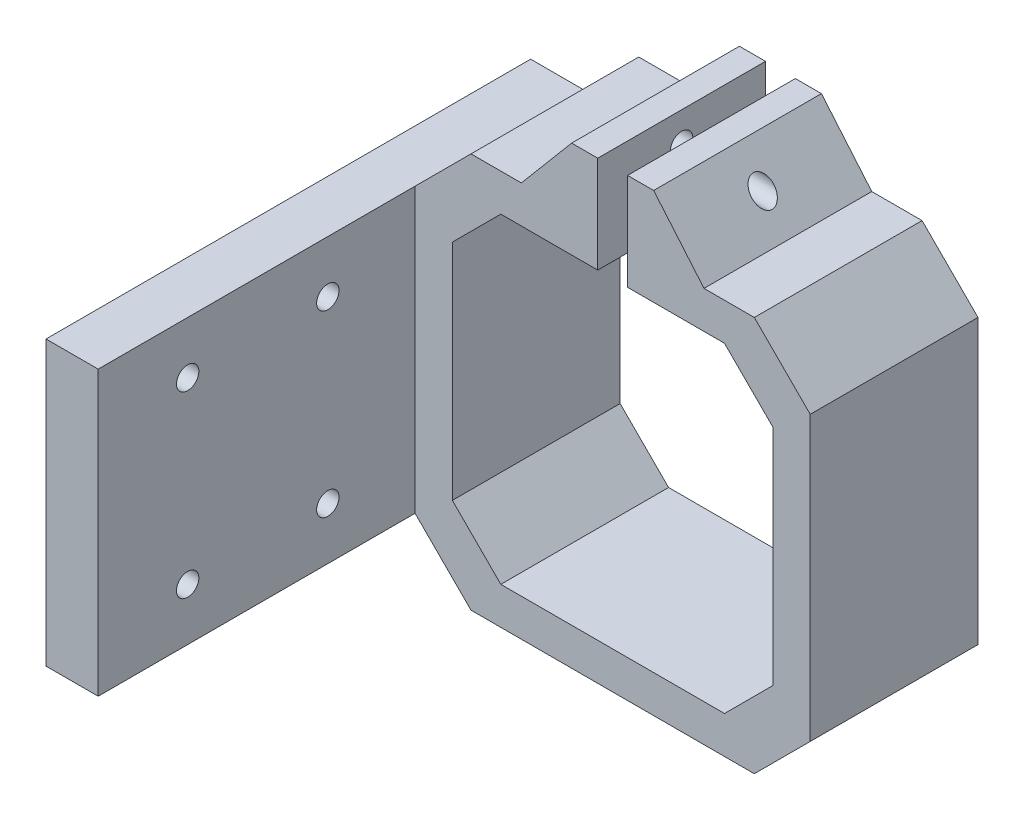
ISO-10303-21;
HEADER;
FILE_DESCRIPTION(('STEP AP214'),'2;1');
FILE_NAME('part.step','',(''),(''),'','','');
FILE_SCHEMA(('AUTOMOTIVE_DESIGN { 1 0 10303 214 1 1 1 1 }'));
ENDSEC;
DATA;
#1=APPLICATION_CONTEXT('core data for automotive mechanical design processes');
#2=APPLICATION_PROTOCOL_DEFINITION('international standard','automotive_design',2000,#1);
#3=PRODUCT_CONTEXT('',#1,'mechanical');
#4=PRODUCT('Part','Part','',(#3));
#5=PRODUCT_RELATED_PRODUCT_CATEGORY('part','',(#4));
#6=PRODUCT_DEFINITION_FORMATION('','',#4);
#7=PRODUCT_DEFINITION_CONTEXT('part definition',#1,'design');
#8=PRODUCT_DEFINITION('design','',#6,#7);
#9=PRODUCT_DEFINITION_SHAPE('','',#8);
#10=(LENGTH_UNIT() NAMED_UNIT(*) SI_UNIT(.MILLI.,.METRE.));
#11=(NAMED_UNIT(*) PLANE_ANGLE_UNIT() SI_UNIT($,.RADIAN.));
#12=(NAMED_UNIT(*) SI_UNIT($,.STERADIAN.) SOLID_ANGLE_UNIT());
#13=UNCERTAINTY_MEASURE_WITH_UNIT(LENGTH_MEASURE(1.E-05),#10,'distance_accuracy_value','');
#14=(GEOMETRIC_REPRESENTATION_CONTEXT(3) GLOBAL_UNCERTAINTY_ASSIGNED_CONTEXT((#13)) GLOBAL_UNIT_ASSIGNED_CONTEXT((#10,
#11,#12)) REPRESENTATION_CONTEXT('',''));
#15=CARTESIAN_POINT('',(0.,0.,0.));
#16=DIRECTION('',(0.,0.,1.));
#17=DIRECTION('',(1.,0.,0.));
#18=AXIS2_PLACEMENT_3D('',#15,#16,#17);
#19=CARTESIAN_POINT('',(-2.,21.5,22.5));
#20=DIRECTION('',(0.,1.,0.));
#21=DIRECTION('',(0.,0.,1.));
#22=AXIS2_PLACEMENT_3D('',#19,#20,#21);
#23=PLANE('',#22);
#24=DIRECTION('',(1.,0.,0.));
#25=VECTOR('',#24,1.);
#26=CARTESIAN_POINT('',(-2.,21.5,0.));
#27=LINE('',#26,#25);
#28=CARTESIAN_POINT('',(-15.,21.5,0.));
#29=VERTEX_POINT('',#28);
#30=CARTESIAN_POINT('',(-2.,21.5,0.));
#31=VERTEX_POINT('',#30);
#32=EDGE_CURVE('E221',#29,#31,#27,.T.);
#33=ORIENTED_EDGE('',*,*,#32,.T.);
#34=DIRECTION('',(0.,0.,-1.));
#35=VECTOR('',#34,1.);
#36=CARTESIAN_POINT('',(-2.,21.5,22.5));
#37=LINE('',#36,#35);
#38=CARTESIAN_POINT('',(-2.,21.5,22.5));
#39=VERTEX_POINT('',#38);
#40=EDGE_CURVE('E11',#39,#31,#37,.T.);
#41=ORIENTED_EDGE('',*,*,#40,.F.);
#42=DIRECTION('',(1.,0.,0.));
#43=VECTOR('',#42,1.);
#44=CARTESIAN_POINT('',(-2.,21.5,22.5));
#45=LINE('',#44,#43);
#46=CARTESIAN_POINT('',(-15.,21.5,22.5));
#47=VERTEX_POINT('',#46);
#48=EDGE_CURVE('E267',#47,#39,#45,.T.);
#49=ORIENTED_EDGE('',*,*,#48,.F.);
#50=DIRECTION('',(0.,0.,-1.));
#51=VECTOR('',#50,1.);
#52=CARTESIAN_POINT('',(-15.,21.5,22.5));
#53=LINE('',#52,#51);
#54=EDGE_CURVE('E217',#47,#29,#53,.T.);
#55=ORIENTED_EDGE('',*,*,#54,.T.);
#56=EDGE_LOOP('',(#33,#41,#49,#55));
#57=FACE_BOUND('',#56,.T.);
#58=ADVANCED_FACE('F33',(#57),#23,.F.);
#59=CARTESIAN_POINT('',(-2.,34.5,22.5));
#60=DIRECTION('',(-1.,0.,0.));
#61=DIRECTION('',(0.,-1.,0.));
#62=AXIS2_PLACEMENT_3D('',#59,#60,#61);
#63=PLANE('',#62);
#64=CARTESIAN_POINT('',(-2.,30.5,11.25));
#65=DIRECTION('',(-1.,0.,0.));
#66=DIRECTION('',(0.,-1.,0.));
#67=AXIS2_PLACEMENT_3D('',#64,#65,#66);
#68=CIRCLE('',#67,1.5);
#69=CARTESIAN_POINT('',(-2.,29.,11.25));
#70=VERTEX_POINT('',#69);
#71=EDGE_CURVE('E731',#70,#70,#68,.T.);
#72=ORIENTED_EDGE('',*,*,#71,.T.);
#73=EDGE_LOOP('',(#72));
#74=FACE_BOUND('',#73,.T.);
#75=DIRECTION('',(0.,1.,0.));
#76=VECTOR('',#75,1.);
#77=CARTESIAN_POINT('',(-2.,34.5,0.));
#78=LINE('',#77,#76);
#79=CARTESIAN_POINT('',(-2.,34.5,0.));
#80=VERTEX_POINT('',#79);
#81=EDGE_CURVE('E224',#31,#80,#78,.T.);
#82=ORIENTED_EDGE('',*,*,#81,.T.);
#83=DIRECTION('',(0.,0.,-1.));
#84=VECTOR('',#83,1.);
#85=CARTESIAN_POINT('',(-2.,34.5,22.5));
#86=LINE('',#85,#84);
#87=CARTESIAN_POINT('',(-2.,34.5,22.5));
#88=VERTEX_POINT('',#87);
#89=EDGE_CURVE('E42',#88,#80,#86,.T.);
#90=ORIENTED_EDGE('',*,*,#89,.F.);
#91=DIRECTION('',(0.,1.,0.));
#92=VECTOR('',#91,1.);
#93=CARTESIAN_POINT('',(-2.,34.5,22.5));
#94=LINE('',#93,#92);
#95=EDGE_CURVE('E137',#39,#88,#94,.T.);
#96=ORIENTED_EDGE('',*,*,#95,.F.);
#97=ORIENTED_EDGE('',*,*,#40,.T.);
#98=EDGE_LOOP('',(#82,#90,#96,#97));
#99=FACE_BOUND('',#98,.T.);
#100=ADVANCED_FACE('F387',(#74,#99),#63,.F.);
#101=CARTESIAN_POINT('',(-5.5,34.5,22.5));
#102=DIRECTION('',(0.,-1.,0.));
#103=DIRECTION('',(0.,0.,-1.));
#104=AXIS2_PLACEMENT_3D('',#101,#102,#103);
#105=PLANE('',#104);
#106=DIRECTION('',(-1.,0.,0.));
#107=VECTOR('',#106,1.);
#108=CARTESIAN_POINT('',(-5.5,34.5,0.));
#109=LINE('',#108,#107);
#110=CARTESIAN_POINT('',(-5.5,34.5,0.));
#111=VERTEX_POINT('',#110);
#112=EDGE_CURVE('E227',#80,#111,#109,.T.);
#113=ORIENTED_EDGE('',*,*,#112,.T.);
#114=DIRECTION('',(0.,0.,-1.));
#115=VECTOR('',#114,1.);
#116=CARTESIAN_POINT('',(-5.5,34.5,22.5));
#117=LINE('',#116,#115);
#118=CARTESIAN_POINT('',(-5.5,34.5,22.5));
#119=VERTEX_POINT('',#118);
#120=EDGE_CURVE('E318',#119,#111,#117,.T.);
#121=ORIENTED_EDGE('',*,*,#120,.F.);
#122=DIRECTION('',(-1.,0.,0.));
#123=VECTOR('',#122,1.);
#124=CARTESIAN_POINT('',(-5.5,34.5,22.5));
#125=LINE('',#124,#123);
#126=EDGE_CURVE('E741',#88,#119,#125,.T.);
#127=ORIENTED_EDGE('',*,*,#126,.F.);
#128=ORIENTED_EDGE('',*,*,#89,.T.);
#129=EDGE_LOOP('',(#113,#121,#127,#128));
#130=FACE_BOUND('',#129,.T.);
#131=ADVANCED_FACE('F392',(#130),#105,.F.);
#132=CARTESIAN_POINT('',(-12.25,26.5,22.5));
#133=DIRECTION('',(0.764291483507891,-0.644870939209783,0.));
#134=DIRECTION('',(0.644870939209783,0.764291483507891,0.));
#135=AXIS2_PLACEMENT_3D('',#132,#133,#134);
#136=PLANE('',#135);
#137=CARTESIAN_POINT('',(-8.875,30.5,11.25));
#138=DIRECTION('',(0.764291483507891,-0.644870939209783,0.));
#139=DIRECTION('',(0.644870939209783,0.764291483507891,0.));
#140=AXIS2_PLACEMENT_3D('',#137,#138,#139);
#141=ELLIPSE('',#140,1.96260200769922,1.5);
#142=CARTESIAN_POINT('',(-7.609375,32.,11.25));
#143=VERTEX_POINT('',#142);
#144=EDGE_CURVE('E752',#143,#143,#141,.T.);
#145=ORIENTED_EDGE('',*,*,#144,.T.);
#146=EDGE_LOOP('',(#145));
#147=FACE_BOUND('',#146,.T.);
#148=DIRECTION('',(-0.644870939209783,-0.764291483507891,0.));
#149=VECTOR('',#148,1.);
#150=CARTESIAN_POINT('',(-12.25,26.5,0.));
#151=LINE('',#150,#149);
#152=CARTESIAN_POINT('',(-12.25,26.5,0.));
#153=VERTEX_POINT('',#152);
#154=EDGE_CURVE('E229',#111,#153,#151,.T.);
#155=ORIENTED_EDGE('',*,*,#154,.T.);
#156=DIRECTION('',(0.,0.,-1.));
#157=VECTOR('',#156,1.);
#158=CARTESIAN_POINT('',(-12.25,26.5,22.5));
#159=LINE('',#158,#157);
#160=CARTESIAN_POINT('',(-12.25,26.5,22.5));
#161=VERTEX_POINT('',#160);
#162=EDGE_CURVE('E314',#161,#153,#159,.T.);
#163=ORIENTED_EDGE('',*,*,#162,.F.);
#164=DIRECTION('',(-0.644870939209783,-0.764291483507891,0.));
#165=VECTOR('',#164,1.);
#166=CARTESIAN_POINT('',(-12.25,26.5,22.5));
#167=LINE('',#166,#165);
#168=EDGE_CURVE('E742',#119,#161,#167,.T.);
#169=ORIENTED_EDGE('',*,*,#168,.F.);
#170=ORIENTED_EDGE('',*,*,#120,.T.);
#171=EDGE_LOOP('',(#155,#163,#169,#170));
#172=FACE_BOUND('',#171,.T.);
#173=ADVANCED_FACE('F398',(#147,#172),#136,.F.);
#174=CARTESIAN_POINT('',(-19.,26.5,22.5));
#175=DIRECTION('',(0.,-1.,0.));
#176=DIRECTION('',(0.,0.,-1.));
#177=AXIS2_PLACEMENT_3D('',#174,#175,#176);
#178=PLANE('',#177);
#179=DIRECTION('',(-1.,0.,0.));
#180=VECTOR('',#179,1.);
#181=CARTESIAN_POINT('',(-19.,26.5,0.));
#182=LINE('',#181,#180);
#183=CARTESIAN_POINT('',(-19.,26.5,0.));
#184=VERTEX_POINT('',#183);
#185=EDGE_CURVE('E231',#153,#184,#182,.T.);
#186=ORIENTED_EDGE('',*,*,#185,.T.);
#187=DIRECTION('',(0.,0.,-1.));
#188=VECTOR('',#187,1.);
#189=CARTESIAN_POINT('',(-19.,26.5,22.5));
#190=LINE('',#189,#188);
#191=CARTESIAN_POINT('',(-19.,26.5,22.5));
#192=VERTEX_POINT('',#191);
#193=EDGE_CURVE('E311',#192,#184,#190,.T.);
#194=ORIENTED_EDGE('',*,*,#193,.F.);
#195=DIRECTION('',(-1.,0.,0.));
#196=VECTOR('',#195,1.);
#197=CARTESIAN_POINT('',(-19.,26.5,22.5));
#198=LINE('',#197,#196);
#199=EDGE_CURVE('E333',#161,#192,#198,.T.);
#200=ORIENTED_EDGE('',*,*,#199,.F.);
#201=ORIENTED_EDGE('',*,*,#162,.T.);
#202=EDGE_LOOP('',(#186,#194,#200,#201));
#203=FACE_BOUND('',#202,.T.);
#204=ADVANCED_FACE('F404',(#203),#178,.F.);
#205=CARTESIAN_POINT('',(-26.5,19.,22.5));
#206=DIRECTION('',(0.707106781186548,-0.707106781186547,0.));
#207=DIRECTION('',(0.707106781186547,0.707106781186548,0.));
#208=AXIS2_PLACEMENT_3D('',#205,#206,#207);
#209=PLANE('',#208);
#210=DIRECTION('',(-0.707106781186547,-0.707106781186548,0.));
#211=VECTOR('',#210,1.);
#212=CARTESIAN_POINT('',(-26.5,19.,0.));
#213=LINE('',#212,#211);
#214=CARTESIAN_POINT('',(-26.5,19.,0.));
#215=VERTEX_POINT('',#214);
#216=EDGE_CURVE('E233',#184,#215,#213,.T.);
#217=ORIENTED_EDGE('',*,*,#216,.T.);
#218=DIRECTION('',(0.,0.,-1.));
#219=VECTOR('',#218,1.);
#220=CARTESIAN_POINT('',(-26.5,19.,22.5));
#221=LINE('',#220,#219);
#222=CARTESIAN_POINT('',(-26.5,19.,22.5));
#223=VERTEX_POINT('',#222);
#224=EDGE_CURVE('E315',#223,#215,#221,.T.);
#225=ORIENTED_EDGE('',*,*,#224,.F.);
#226=DIRECTION('',(-0.707106781186547,-0.707106781186548,0.));
#227=VECTOR('',#226,1.);
#228=CARTESIAN_POINT('',(-26.5,19.,22.5));
#229=LINE('',#228,#227);
#230=EDGE_CURVE('E328',#192,#223,#229,.T.);
#231=ORIENTED_EDGE('',*,*,#230,.F.);
#232=ORIENTED_EDGE('',*,*,#193,.T.);
#233=EDGE_LOOP('',(#217,#225,#231,#232));
#234=FACE_BOUND('',#233,.T.);
#235=ADVANCED_FACE('F408',(#234),#209,.F.);
#236=CARTESIAN_POINT('',(-19.,-26.5,22.5));
#237=DIRECTION('',(0.707106781186548,0.707106781186547,0.));
#238=DIRECTION('',(-0.707106781186547,0.707106781186548,0.));
#239=AXIS2_PLACEMENT_3D('',#236,#237,#238);
#240=PLANE('',#239);
#241=DIRECTION('',(0.707106781186547,-0.707106781186548,0.));
#242=VECTOR('',#241,1.);
#243=CARTESIAN_POINT('',(-19.,-26.5,0.));
#244=LINE('',#243,#242);
#245=CARTESIAN_POINT('',(-26.5,-19.,0.));
#246=VERTEX_POINT('',#245);
#247=CARTESIAN_POINT('',(-19.,-26.5,0.));
#248=VERTEX_POINT('',#247);
#249=EDGE_CURVE('E236',#246,#248,#244,.T.);
#250=ORIENTED_EDGE('',*,*,#249,.T.);
#251=DIRECTION('',(0.,0.,-1.));
#252=VECTOR('',#251,1.);
#253=CARTESIAN_POINT('',(-19.,-26.5,22.5));
#254=LINE('',#253,#252);
#255=CARTESIAN_POINT('',(-19.,-26.5,22.5));
#256=VERTEX_POINT('',#255);
#257=EDGE_CURVE('E307',#256,#248,#254,.T.);
#258=ORIENTED_EDGE('',*,*,#257,.F.);
#259=DIRECTION('',(0.707106781186547,-0.707106781186548,0.));
#260=VECTOR('',#259,1.);
#261=CARTESIAN_POINT('',(-19.,-26.5,22.5));
#262=LINE('',#261,#260);
#263=CARTESIAN_POINT('',(-26.5,-19.,22.5));
#264=VERTEX_POINT('',#263);
#265=EDGE_CURVE('E327',#264,#256,#262,.T.);
#266=ORIENTED_EDGE('',*,*,#265,.F.);
#267=DIRECTION('',(0.,0.,-1.));
#268=VECTOR('',#267,1.);
#269=CARTESIAN_POINT('',(-26.5,-19.,22.5));
#270=LINE('',#269,#268);
#271=EDGE_CURVE('E310',#264,#246,#270,.T.);
#272=ORIENTED_EDGE('',*,*,#271,.T.);
#273=EDGE_LOOP('',(#250,#258,#266,#272));
#274=FACE_BOUND('',#273,.T.);
#275=ADVANCED_FACE('F412',(#274),#240,.F.);
#276=CARTESIAN_POINT('',(19.,-26.5,22.5));
#277=DIRECTION('',(0.,1.,0.));
#278=DIRECTION('',(0.,0.,1.));
#279=AXIS2_PLACEMENT_3D('',#276,#277,#278);
#280=PLANE('',#279);
#281=DIRECTION('',(1.,0.,0.));
#282=VECTOR('',#281,1.);
#283=CARTESIAN_POINT('',(19.,-26.5,0.));
#284=LINE('',#283,#282);
#285=CARTESIAN_POINT('',(19.,-26.5,0.));
#286=VERTEX_POINT('',#285);
#287=EDGE_CURVE('E238',#248,#286,#284,.T.);
#288=ORIENTED_EDGE('',*,*,#287,.T.);
#289=DIRECTION('',(0.,0.,-1.));
#290=VECTOR('',#289,1.);
#291=CARTESIAN_POINT('',(19.,-26.5,22.5));
#292=LINE('',#291,#290);
#293=CARTESIAN_POINT('',(19.,-26.5,22.5));
#294=VERTEX_POINT('',#293);
#295=EDGE_CURVE('E304',#294,#286,#292,.T.);
#296=ORIENTED_EDGE('',*,*,#295,.F.);
#297=DIRECTION('',(1.,0.,0.));
#298=VECTOR('',#297,1.);
#299=CARTESIAN_POINT('',(19.,-26.5,22.5));
#300=LINE('',#299,#298);
#301=EDGE_CURVE('E335',#256,#294,#300,.T.);
#302=ORIENTED_EDGE('',*,*,#301,.F.);
#303=ORIENTED_EDGE('',*,*,#257,.T.);
#304=EDGE_LOOP('',(#288,#296,#302,#303));
#305=FACE_BOUND('',#304,.T.);
#306=ADVANCED_FACE('F416',(#305),#280,.F.);
#307=CARTESIAN_POINT('',(26.5,-19.,22.5));
#308=DIRECTION('',(-0.707106781186545,0.70710678118655,0.));
#309=DIRECTION('',(-0.70710678118655,-0.707106781186545,0.));
#310=AXIS2_PLACEMENT_3D('',#307,#308,#309);
#311=PLANE('',#310);
#312=DIRECTION('',(0.70710678118655,0.707106781186545,0.));
#313=VECTOR('',#312,1.);
#314=CARTESIAN_POINT('',(26.5,-19.,0.));
#315=LINE('',#314,#313);
#316=CARTESIAN_POINT('',(26.5,-19.,0.));
#317=VERTEX_POINT('',#316);
#318=EDGE_CURVE('E240',#286,#317,#315,.T.);
#319=ORIENTED_EDGE('',*,*,#318,.T.);
#320=DIRECTION('',(0.,0.,-1.));
#321=VECTOR('',#320,1.);
#322=CARTESIAN_POINT('',(26.5,-19.,22.5));
#323=LINE('',#322,#321);
#324=CARTESIAN_POINT('',(26.5,-19.,22.5));
#325=VERTEX_POINT('',#324);
#326=EDGE_CURVE('E301',#325,#317,#323,.T.);
#327=ORIENTED_EDGE('',*,*,#326,.F.);
#328=DIRECTION('',(0.70710678118655,0.707106781186545,0.));
#329=VECTOR('',#328,1.);
#330=CARTESIAN_POINT('',(26.5,-19.,22.5));
#331=LINE('',#330,#329);
#332=EDGE_CURVE('E337',#294,#325,#331,.T.);
#333=ORIENTED_EDGE('',*,*,#332,.F.);
#334=ORIENTED_EDGE('',*,*,#295,.T.);
#335=EDGE_LOOP('',(#319,#327,#333,#334));
#336=FACE_BOUND('',#335,.T.);
#337=ADVANCED_FACE('F420',(#336),#311,.F.);
#338=CARTESIAN_POINT('',(26.5,19.,22.5));
#339=DIRECTION('',(-1.,0.,0.));
#340=DIRECTION('',(0.,-1.,0.));
#341=AXIS2_PLACEMENT_3D('',#338,#339,#340);
#342=PLANE('',#341);
#343=DIRECTION('',(0.,1.,0.));
#344=VECTOR('',#343,1.);
#345=CARTESIAN_POINT('',(26.5,19.,0.));
#346=LINE('',#345,#344);
#347=CARTESIAN_POINT('',(26.5,19.,0.));
#348=VERTEX_POINT('',#347);
#349=EDGE_CURVE('E242',#317,#348,#346,.T.);
#350=ORIENTED_EDGE('',*,*,#349,.T.);
#351=DIRECTION('',(0.,0.,-1.));
#352=VECTOR('',#351,1.);
#353=CARTESIAN_POINT('',(26.5,19.,22.5));
#354=LINE('',#353,#352);
#355=CARTESIAN_POINT('',(26.5,19.,22.5));
#356=VERTEX_POINT('',#355);
#357=EDGE_CURVE('E298',#356,#348,#354,.T.);
#358=ORIENTED_EDGE('',*,*,#357,.F.);
#359=DIRECTION('',(0.,1.,0.));
#360=VECTOR('',#359,1.);
#361=CARTESIAN_POINT('',(26.5,19.,22.5));
#362=LINE('',#361,#360);
#363=EDGE_CURVE('E339',#325,#356,#362,.T.);
#364=ORIENTED_EDGE('',*,*,#363,.F.);
#365=ORIENTED_EDGE('',*,*,#326,.T.);
#366=EDGE_LOOP('',(#350,#358,#364,#365));
#367=FACE_BOUND('',#366,.T.);
#368=ADVANCED_FACE('F424',(#367),#342,.F.);
#369=CARTESIAN_POINT('',(19.,26.5,22.5));
#370=DIRECTION('',(-0.707106781186551,-0.707106781186543,0.));
#371=DIRECTION('',(0.707106781186544,-0.707106781186552,0.));
#372=AXIS2_PLACEMENT_3D('',#369,#370,#371);
#373=PLANE('',#372);
#374=DIRECTION('',(-0.707106781186544,0.707106781186551,0.));
#375=VECTOR('',#374,1.);
#376=CARTESIAN_POINT('',(19.,26.5,0.));
#377=LINE('',#376,#375);
#378=CARTESIAN_POINT('',(19.,26.5,0.));
#379=VERTEX_POINT('',#378);
#380=EDGE_CURVE('E244',#348,#379,#377,.T.);
#381=ORIENTED_EDGE('',*,*,#380,.T.);
#382=DIRECTION('',(0.,0.,-1.));
#383=VECTOR('',#382,1.);
#384=CARTESIAN_POINT('',(19.,26.5,22.5));
#385=LINE('',#384,#383);
#386=CARTESIAN_POINT('',(19.,26.5,22.5));
#387=VERTEX_POINT('',#386);
#388=EDGE_CURVE('E295',#387,#379,#385,.T.);
#389=ORIENTED_EDGE('',*,*,#388,.F.);
#390=DIRECTION('',(-0.707106781186544,0.707106781186551,0.));
#391=VECTOR('',#390,1.);
#392=CARTESIAN_POINT('',(19.,26.5,22.5));
#393=LINE('',#392,#391);
#394=EDGE_CURVE('E341',#356,#387,#393,.T.);
#395=ORIENTED_EDGE('',*,*,#394,.F.);
#396=ORIENTED_EDGE('',*,*,#357,.T.);
#397=EDGE_LOOP('',(#381,#389,#395,#396));
#398=FACE_BOUND('',#397,.T.);
#399=ADVANCED_FACE('F428',(#398),#373,.F.);
#400=CARTESIAN_POINT('',(12.25,26.5,22.5));
#401=DIRECTION('',(0.,-1.,0.));
#402=DIRECTION('',(0.,0.,-1.));
#403=AXIS2_PLACEMENT_3D('',#400,#401,#402);
#404=PLANE('',#403);
#405=DIRECTION('',(-1.,0.,0.));
#406=VECTOR('',#405,1.);
#407=CARTESIAN_POINT('',(12.25,26.5,0.));
#408=LINE('',#407,#406);
#409=CARTESIAN_POINT('',(12.25,26.5,0.));
#410=VERTEX_POINT('',#409);
#411=EDGE_CURVE('E246',#379,#410,#408,.T.);
#412=ORIENTED_EDGE('',*,*,#411,.T.);
#413=DIRECTION('',(0.,0.,-1.));
#414=VECTOR('',#413,1.);
#415=CARTESIAN_POINT('',(12.25,26.5,22.5));
#416=LINE('',#415,#414);
#417=CARTESIAN_POINT('',(12.25,26.5,22.5));
#418=VERTEX_POINT('',#417);
#419=EDGE_CURVE('E292',#418,#410,#416,.T.);
#420=ORIENTED_EDGE('',*,*,#419,.F.);
#421=DIRECTION('',(-1.,0.,0.));
#422=VECTOR('',#421,1.);
#423=CARTESIAN_POINT('',(12.25,26.5,22.5));
#424=LINE('',#423,#422);
#425=EDGE_CURVE('E343',#387,#418,#424,.T.);
#426=ORIENTED_EDGE('',*,*,#425,.F.);
#427=ORIENTED_EDGE('',*,*,#388,.T.);
#428=EDGE_LOOP('',(#412,#420,#426,#427));
#429=FACE_BOUND('',#428,.T.);
#430=ADVANCED_FACE('F432',(#429),#404,.F.);
#431=CARTESIAN_POINT('',(5.5,34.5,22.5));
#432=DIRECTION('',(-0.764291483507891,-0.644870939209783,0.));
#433=DIRECTION('',(0.644870939209783,-0.764291483507891,0.));
#434=AXIS2_PLACEMENT_3D('',#431,#432,#433);
#435=PLANE('',#434);
#436=CARTESIAN_POINT('',(8.875,30.5,11.25));
#437=DIRECTION('',(-0.764291483507891,-0.644870939209783,0.));
#438=DIRECTION('',(0.644870939209783,-0.764291483507891,0.));
#439=AXIS2_PLACEMENT_3D('',#436,#437,#438);
#440=ELLIPSE('',#439,1.96260200769922,1.5);
#441=CARTESIAN_POINT('',(10.140625,29.,11.25));
#442=VERTEX_POINT('',#441);
#443=EDGE_CURVE('E755',#442,#442,#440,.T.);
#444=ORIENTED_EDGE('',*,*,#443,.T.);
#445=EDGE_LOOP('',(#444));
#446=FACE_BOUND('',#445,.T.);
#447=DIRECTION('',(-0.644870939209783,0.764291483507891,0.));
#448=VECTOR('',#447,1.);
#449=CARTESIAN_POINT('',(5.5,34.5,0.));
#450=LINE('',#449,#448);
#451=CARTESIAN_POINT('',(5.5,34.5,0.));
#452=VERTEX_POINT('',#451);
#453=EDGE_CURVE('E248',#410,#452,#450,.T.);
#454=ORIENTED_EDGE('',*,*,#453,.T.);
#455=DIRECTION('',(0.,0.,-1.));
#456=VECTOR('',#455,1.);
#457=CARTESIAN_POINT('',(5.5,34.5,22.5));
#458=LINE('',#457,#456);
#459=CARTESIAN_POINT('',(5.5,34.5,22.5));
#460=VERTEX_POINT('',#459);
#461=EDGE_CURVE('E289',#460,#452,#458,.T.);
#462=ORIENTED_EDGE('',*,*,#461,.F.);
#463=DIRECTION('',(-0.644870939209783,0.764291483507891,0.));
#464=VECTOR('',#463,1.);
#465=CARTESIAN_POINT('',(5.5,34.5,22.5));
#466=LINE('',#465,#464);
#467=EDGE_CURVE('E345',#418,#460,#466,.T.);
#468=ORIENTED_EDGE('',*,*,#467,.F.);
#469=ORIENTED_EDGE('',*,*,#419,.T.);
#470=EDGE_LOOP('',(#454,#462,#468,#469));
#471=FACE_BOUND('',#470,.T.);
#472=ADVANCED_FACE('F436',(#446,#471),#435,.F.);
#473=CARTESIAN_POINT('',(2.,34.5,22.5));
#474=DIRECTION('',(0.,-1.,0.));
#475=DIRECTION('',(0.,0.,-1.));
#476=AXIS2_PLACEMENT_3D('',#473,#474,#475);
#477=PLANE('',#476);
#478=DIRECTION('',(-1.,0.,0.));
#479=VECTOR('',#478,1.);
#480=CARTESIAN_POINT('',(2.,34.5,0.));
#481=LINE('',#480,#479);
#482=CARTESIAN_POINT('',(2.,34.5,0.));
#483=VERTEX_POINT('',#482);
#484=EDGE_CURVE('E250',#452,#483,#481,.T.);
#485=ORIENTED_EDGE('',*,*,#484,.T.);
#486=DIRECTION('',(0.,0.,-1.));
#487=VECTOR('',#486,1.);
#488=CARTESIAN_POINT('',(2.,34.5,22.5));
#489=LINE('',#488,#487);
#490=CARTESIAN_POINT('',(2.,34.5,22.5));
#491=VERTEX_POINT('',#490);
#492=EDGE_CURVE('E286',#491,#483,#489,.T.);
#493=ORIENTED_EDGE('',*,*,#492,.F.);
#494=DIRECTION('',(-1.,0.,0.));
#495=VECTOR('',#494,1.);
#496=CARTESIAN_POINT('',(2.,34.5,22.5));
#497=LINE('',#496,#495);
#498=EDGE_CURVE('E347',#460,#491,#497,.T.);
#499=ORIENTED_EDGE('',*,*,#498,.F.);
#500=ORIENTED_EDGE('',*,*,#461,.T.);
#501=EDGE_LOOP('',(#485,#493,#499,#500));
#502=FACE_BOUND('',#501,.T.);
#503=ADVANCED_FACE('F440',(#502),#477,.F.);
#504=CARTESIAN_POINT('',(2.,34.5,22.5));
#505=DIRECTION('',(1.,0.,0.));
#506=DIRECTION('',(0.,1.,0.));
#507=AXIS2_PLACEMENT_3D('',#504,#505,#506);
#508=PLANE('',#507);
#509=CARTESIAN_POINT('',(1.99999999999999,30.5,11.25));
#510=DIRECTION('',(1.,0.,0.));
#511=DIRECTION('',(0.,1.,0.));
#512=AXIS2_PLACEMENT_3D('',#509,#510,#511);
#513=CIRCLE('',#512,1.5);
#514=CARTESIAN_POINT('',(1.99999999999999,32.,11.25));
#515=VERTEX_POINT('',#514);
#516=EDGE_CURVE('E36',#515,#515,#513,.T.);
#517=ORIENTED_EDGE('',*,*,#516,.T.);
#518=EDGE_LOOP('',(#517));
#519=FACE_BOUND('',#518,.T.);
#520=DIRECTION('',(0.,-1.,0.));
#521=VECTOR('',#520,1.);
#522=CARTESIAN_POINT('',(2.,34.5,0.));
#523=LINE('',#522,#521);
#524=CARTESIAN_POINT('',(2.,21.5,0.));
#525=VERTEX_POINT('',#524);
#526=EDGE_CURVE('E252',#483,#525,#523,.T.);
#527=ORIENTED_EDGE('',*,*,#526,.T.);
#528=DIRECTION('',(0.,0.,-1.));
#529=VECTOR('',#528,1.);
#530=CARTESIAN_POINT('',(2.,21.5,22.5));
#531=LINE('',#530,#529);
#532=CARTESIAN_POINT('',(2.,21.5,22.5));
#533=VERTEX_POINT('',#532);
#534=EDGE_CURVE('E283',#533,#525,#531,.T.);
#535=ORIENTED_EDGE('',*,*,#534,.F.);
#536=DIRECTION('',(0.,-1.,0.));
#537=VECTOR('',#536,1.);
#538=CARTESIAN_POINT('',(2.,34.5,22.5));
#539=LINE('',#538,#537);
#540=EDGE_CURVE('E349',#491,#533,#539,.T.);
#541=ORIENTED_EDGE('',*,*,#540,.F.);
#542=ORIENTED_EDGE('',*,*,#492,.T.);
#543=EDGE_LOOP('',(#527,#535,#541,#542));
#544=FACE_BOUND('',#543,.T.);
#545=ADVANCED_FACE('F444',(#519,#544),#508,.F.);
#546=CARTESIAN_POINT('',(15.,21.5,22.5));
#547=DIRECTION('',(0.,1.,0.));
#548=DIRECTION('',(0.,0.,1.));
#549=AXIS2_PLACEMENT_3D('',#546,#547,#548);
#550=PLANE('',#549);
#551=DIRECTION('',(1.,0.,0.));
#552=VECTOR('',#551,1.);
#553=CARTESIAN_POINT('',(15.,21.5,0.));
#554=LINE('',#553,#552);
#555=CARTESIAN_POINT('',(15.,21.5,0.));
#556=VERTEX_POINT('',#555);
#557=EDGE_CURVE('E254',#525,#556,#554,.T.);
#558=ORIENTED_EDGE('',*,*,#557,.T.);
#559=DIRECTION('',(0.,0.,-1.));
#560=VECTOR('',#559,1.);
#561=CARTESIAN_POINT('',(15.,21.5,22.5));
#562=LINE('',#561,#560);
#563=CARTESIAN_POINT('',(15.,21.5,22.5));
#564=VERTEX_POINT('',#563);
#565=EDGE_CURVE('E280',#564,#556,#562,.T.);
#566=ORIENTED_EDGE('',*,*,#565,.F.);
#567=DIRECTION('',(1.,0.,0.));
#568=VECTOR('',#567,1.);
#569=CARTESIAN_POINT('',(15.,21.5,22.5));
#570=LINE('',#569,#568);
#571=EDGE_CURVE('E351',#533,#564,#570,.T.);
#572=ORIENTED_EDGE('',*,*,#571,.F.);
#573=ORIENTED_EDGE('',*,*,#534,.T.);
#574=EDGE_LOOP('',(#558,#566,#572,#573));
#575=FACE_BOUND('',#574,.T.);
#576=ADVANCED_FACE('F448',(#575),#550,.F.);
#577=CARTESIAN_POINT('',(21.5,15.,22.5));
#578=DIRECTION('',(0.707106781186547,0.707106781186548,0.));
#579=DIRECTION('',(-0.707106781186548,0.707106781186547,0.));
#580=AXIS2_PLACEMENT_3D('',#577,#578,#579);
#581=PLANE('',#580);
#582=DIRECTION('',(0.707106781186548,-0.707106781186547,0.));
#583=VECTOR('',#582,1.);
#584=CARTESIAN_POINT('',(21.5,15.,0.));
#585=LINE('',#584,#583);
#586=CARTESIAN_POINT('',(21.5,15.,0.));
#587=VERTEX_POINT('',#586);
#588=EDGE_CURVE('E256',#556,#587,#585,.T.);
#589=ORIENTED_EDGE('',*,*,#588,.T.);
#590=DIRECTION('',(0.,0.,-1.));
#591=VECTOR('',#590,1.);
#592=CARTESIAN_POINT('',(21.5,15.,22.5));
#593=LINE('',#592,#591);
#594=CARTESIAN_POINT('',(21.5,15.,22.5));
#595=VERTEX_POINT('',#594);
#596=EDGE_CURVE('E277',#595,#587,#593,.T.);
#597=ORIENTED_EDGE('',*,*,#596,.F.);
#598=DIRECTION('',(0.707106781186548,-0.707106781186547,0.));
#599=VECTOR('',#598,1.);
#600=CARTESIAN_POINT('',(21.5,15.,22.5));
#601=LINE('',#600,#599);
#602=EDGE_CURVE('E353',#564,#595,#601,.T.);
#603=ORIENTED_EDGE('',*,*,#602,.F.);
#604=ORIENTED_EDGE('',*,*,#565,.T.);
#605=EDGE_LOOP('',(#589,#597,#603,#604));
#606=FACE_BOUND('',#605,.T.);
#607=ADVANCED_FACE('F452',(#606),#581,.F.);
#608=CARTESIAN_POINT('',(21.5,-15.,22.5));
#609=DIRECTION('',(1.,0.,0.));
#610=DIRECTION('',(0.,0.,-1.));
#611=AXIS2_PLACEMENT_3D('',#608,#609,#610);
#612=PLANE('',#611);
#613=DIRECTION('',(0.,-1.,0.));
#614=VECTOR('',#613,1.);
#615=CARTESIAN_POINT('',(21.5,-15.,0.));
#616=LINE('',#615,#614);
#617=CARTESIAN_POINT('',(21.5,-15.,0.));
#618=VERTEX_POINT('',#617);
#619=EDGE_CURVE('E258',#587,#618,#616,.T.);
#620=ORIENTED_EDGE('',*,*,#619,.T.);
#621=DIRECTION('',(0.,0.,-1.));
#622=VECTOR('',#621,1.);
#623=CARTESIAN_POINT('',(21.5,-15.,22.5));
#624=LINE('',#623,#622);
#625=CARTESIAN_POINT('',(21.5,-15.,22.5));
#626=VERTEX_POINT('',#625);
#627=EDGE_CURVE('E274',#626,#618,#624,.T.);
#628=ORIENTED_EDGE('',*,*,#627,.F.);
#629=DIRECTION('',(0.,-1.,0.));
#630=VECTOR('',#629,1.);
#631=CARTESIAN_POINT('',(21.5,-15.,22.5));
#632=LINE('',#631,#630);
#633=EDGE_CURVE('E355',#595,#626,#632,.T.);
#634=ORIENTED_EDGE('',*,*,#633,.F.);
#635=ORIENTED_EDGE('',*,*,#596,.T.);
#636=EDGE_LOOP('',(#620,#628,#634,#635));
#637=FACE_BOUND('',#636,.T.);
#638=ADVANCED_FACE('F456',(#637),#612,.F.);
#639=CARTESIAN_POINT('',(15.,-21.5,22.5));
#640=DIRECTION('',(0.707106781186548,-0.707106781186547,0.));
#641=DIRECTION('',(0.707106781186547,0.707106781186548,0.));
#642=AXIS2_PLACEMENT_3D('',#639,#640,#641);
#643=PLANE('',#642);
#644=DIRECTION('',(-0.707106781186547,-0.707106781186548,0.));
#645=VECTOR('',#644,1.);
#646=CARTESIAN_POINT('',(15.,-21.5,0.));
#647=LINE('',#646,#645);
#648=CARTESIAN_POINT('',(15.,-21.5,0.));
#649=VERTEX_POINT('',#648);
#650=EDGE_CURVE('E260',#618,#649,#647,.T.);
#651=ORIENTED_EDGE('',*,*,#650,.T.);
#652=DIRECTION('',(0.,0.,-1.));
#653=VECTOR('',#652,1.);
#654=CARTESIAN_POINT('',(15.,-21.5,22.5));
#655=LINE('',#654,#653);
#656=CARTESIAN_POINT('',(15.,-21.5,22.5));
#657=VERTEX_POINT('',#656);
#658=EDGE_CURVE('E271',#657,#649,#655,.T.);
#659=ORIENTED_EDGE('',*,*,#658,.F.);
#660=DIRECTION('',(-0.707106781186547,-0.707106781186548,0.));
#661=VECTOR('',#660,1.);
#662=CARTESIAN_POINT('',(15.,-21.5,22.5));
#663=LINE('',#662,#661);
#664=EDGE_CURVE('E357',#626,#657,#663,.T.);
#665=ORIENTED_EDGE('',*,*,#664,.F.);
#666=ORIENTED_EDGE('',*,*,#627,.T.);
#667=EDGE_LOOP('',(#651,#659,#665,#666));
#668=FACE_BOUND('',#667,.T.);
#669=ADVANCED_FACE('F363',(#668),#643,.F.);
#670=CARTESIAN_POINT('',(-15.,-21.5,22.5));
#671=DIRECTION('',(0.,-1.,0.));
#672=DIRECTION('',(0.,0.,-1.));
#673=AXIS2_PLACEMENT_3D('',#670,#671,#672);
#674=PLANE('',#673);
#675=DIRECTION('',(-1.,0.,0.));
#676=VECTOR('',#675,1.);
#677=CARTESIAN_POINT('',(-15.,-21.5,0.));
#678=LINE('',#677,#676);
#679=CARTESIAN_POINT('',(-15.,-21.5,0.));
#680=VERTEX_POINT('',#679);
#681=EDGE_CURVE('E262',#649,#680,#678,.T.);
#682=ORIENTED_EDGE('',*,*,#681,.T.);
#683=DIRECTION('',(0.,0.,-1.));
#684=VECTOR('',#683,1.);
#685=CARTESIAN_POINT('',(-15.,-21.5,22.5));
#686=LINE('',#685,#684);
#687=CARTESIAN_POINT('',(-15.,-21.5,22.5));
#688=VERTEX_POINT('',#687);
#689=EDGE_CURVE('E212',#688,#680,#686,.T.);
#690=ORIENTED_EDGE('',*,*,#689,.F.);
#691=DIRECTION('',(-1.,0.,0.));
#692=VECTOR('',#691,1.);
#693=CARTESIAN_POINT('',(-15.,-21.5,22.5));
#694=LINE('',#693,#692);
#695=EDGE_CURVE('E203',#657,#688,#694,.T.);
#696=ORIENTED_EDGE('',*,*,#695,.F.);
#697=ORIENTED_EDGE('',*,*,#658,.T.);
#698=EDGE_LOOP('',(#682,#690,#696,#697));
#699=FACE_BOUND('',#698,.T.);
#700=ADVANCED_FACE('F367',(#699),#674,.F.);
#701=CARTESIAN_POINT('',(-21.5,-15.,22.5));
#702=DIRECTION('',(-0.707106781186547,-0.707106781186548,0.));
#703=DIRECTION('',(0.707106781186548,-0.707106781186547,0.));
#704=AXIS2_PLACEMENT_3D('',#701,#702,#703);
#705=PLANE('',#704);
#706=DIRECTION('',(-0.707106781186548,0.707106781186547,0.));
#707=VECTOR('',#706,1.);
#708=CARTESIAN_POINT('',(-21.5,-15.,0.));
#709=LINE('',#708,#707);
#710=CARTESIAN_POINT('',(-21.5,-15.,0.));
#711=VERTEX_POINT('',#710);
#712=EDGE_CURVE('E211',#680,#711,#709,.T.);
#713=ORIENTED_EDGE('',*,*,#712,.T.);
#714=DIRECTION('',(0.,0.,-1.));
#715=VECTOR('',#714,1.);
#716=CARTESIAN_POINT('',(-21.5,-15.,22.5));
#717=LINE('',#716,#715);
#718=CARTESIAN_POINT('',(-21.5,-15.,22.5));
#719=VERTEX_POINT('',#718);
#720=EDGE_CURVE('E208',#719,#711,#717,.T.);
#721=ORIENTED_EDGE('',*,*,#720,.F.);
#722=DIRECTION('',(-0.707106781186548,0.707106781186547,0.));
#723=VECTOR('',#722,1.);
#724=CARTESIAN_POINT('',(-21.5,-15.,22.5));
#725=LINE('',#724,#723);
#726=EDGE_CURVE('E197',#688,#719,#725,.T.);
#727=ORIENTED_EDGE('',*,*,#726,.F.);
#728=ORIENTED_EDGE('',*,*,#689,.T.);
#729=EDGE_LOOP('',(#713,#721,#727,#728));
#730=FACE_BOUND('',#729,.T.);
#731=ADVANCED_FACE('F209',(#730),#705,.F.);
#732=CARTESIAN_POINT('',(-21.5,15.,22.5));
#733=DIRECTION('',(-1.,0.,0.));
#734=DIRECTION('',(0.,0.,1.));
#735=AXIS2_PLACEMENT_3D('',#732,#733,#734);
#736=PLANE('',#735);
#737=DIRECTION('',(0.,1.,0.));
#738=VECTOR('',#737,1.);
#739=CARTESIAN_POINT('',(-21.5,15.,0.));
#740=LINE('',#739,#738);
#741=CARTESIAN_POINT('',(-21.5,15.,0.));
#742=VERTEX_POINT('',#741);
#743=EDGE_CURVE('E123',#711,#742,#740,.T.);
#744=ORIENTED_EDGE('',*,*,#743,.T.);
#745=DIRECTION('',(0.,0.,-1.));
#746=VECTOR('',#745,1.);
#747=CARTESIAN_POINT('',(-21.5,15.,22.5));
#748=LINE('',#747,#746);
#749=CARTESIAN_POINT('',(-21.5,15.,22.5));
#750=VERTEX_POINT('',#749);
#751=EDGE_CURVE('E213',#750,#742,#748,.T.);
#752=ORIENTED_EDGE('',*,*,#751,.F.);
#753=DIRECTION('',(0.,1.,0.));
#754=VECTOR('',#753,1.);
#755=CARTESIAN_POINT('',(-21.5,15.,22.5));
#756=LINE('',#755,#754);
#757=EDGE_CURVE('E201',#719,#750,#756,.T.);
#758=ORIENTED_EDGE('',*,*,#757,.F.);
#759=ORIENTED_EDGE('',*,*,#720,.T.);
#760=EDGE_LOOP('',(#744,#752,#758,#759));
#761=FACE_BOUND('',#760,.T.);
#762=ADVANCED_FACE('F215',(#761),#736,.F.);
#763=CARTESIAN_POINT('',(-15.,21.5,22.5));
#764=DIRECTION('',(-0.707106781186548,0.707106781186547,0.));
#765=DIRECTION('',(-0.707106781186547,-0.707106781186548,0.));
#766=AXIS2_PLACEMENT_3D('',#763,#764,#765);
#767=PLANE('',#766);
#768=DIRECTION('',(0.707106781186547,0.707106781186548,0.));
#769=VECTOR('',#768,1.);
#770=CARTESIAN_POINT('',(-15.,21.5,0.));
#771=LINE('',#770,#769);
#772=EDGE_CURVE('E129',#742,#29,#771,.T.);
#773=ORIENTED_EDGE('',*,*,#772,.T.);
#774=ORIENTED_EDGE('',*,*,#54,.F.);
#775=DIRECTION('',(0.707106781186547,0.707106781186548,0.));
#776=VECTOR('',#775,1.);
#777=CARTESIAN_POINT('',(-15.,21.5,22.5));
#778=LINE('',#777,#776);
#779=EDGE_CURVE('E51',#750,#47,#778,.T.);
#780=ORIENTED_EDGE('',*,*,#779,.F.);
#781=ORIENTED_EDGE('',*,*,#751,.T.);
#782=EDGE_LOOP('',(#773,#774,#780,#781));
#783=FACE_BOUND('',#782,.T.);
#784=ADVANCED_FACE('F375',(#783),#767,.F.);
#785=CARTESIAN_POINT('',(0.,0.,22.5));
#786=DIRECTION('',(0.,0.,1.));
#787=DIRECTION('',(1.,0.,0.));
#788=AXIS2_PLACEMENT_3D('',#785,#786,#787);
#789=PLANE('',#788);
#790=ORIENTED_EDGE('',*,*,#48,.T.);
#791=ORIENTED_EDGE('',*,*,#95,.T.);
#792=ORIENTED_EDGE('',*,*,#126,.T.);
#793=ORIENTED_EDGE('',*,*,#168,.T.);
#794=ORIENTED_EDGE('',*,*,#199,.T.);
#795=ORIENTED_EDGE('',*,*,#230,.T.);
#796=DIRECTION('',(0.,-1.,0.));
#797=VECTOR('',#796,1.);
#798=CARTESIAN_POINT('',(-26.5,-19.,22.5));
#799=LINE('',#798,#797);
#800=EDGE_CURVE('E323',#223,#264,#799,.T.);
#801=ORIENTED_EDGE('',*,*,#800,.T.);
#802=ORIENTED_EDGE('',*,*,#265,.T.);
#803=ORIENTED_EDGE('',*,*,#301,.T.);
#804=ORIENTED_EDGE('',*,*,#332,.T.);
#805=ORIENTED_EDGE('',*,*,#363,.T.);
#806=ORIENTED_EDGE('',*,*,#394,.T.);
#807=ORIENTED_EDGE('',*,*,#425,.T.);
#808=ORIENTED_EDGE('',*,*,#467,.T.);
#809=ORIENTED_EDGE('',*,*,#498,.T.);
#810=ORIENTED_EDGE('',*,*,#540,.T.);
#811=ORIENTED_EDGE('',*,*,#571,.T.);
#812=ORIENTED_EDGE('',*,*,#602,.T.);
#813=ORIENTED_EDGE('',*,*,#633,.T.);
#814=ORIENTED_EDGE('',*,*,#664,.T.);
#815=ORIENTED_EDGE('',*,*,#695,.T.);
#816=ORIENTED_EDGE('',*,*,#726,.T.);
#817=ORIENTED_EDGE('',*,*,#757,.T.);
#818=ORIENTED_EDGE('',*,*,#779,.T.);
#819=EDGE_LOOP('',(#790,#791,#792,#793,#794,#795,#801,#802,#803,#804,#805,#806,#807,#808,#809,
#810,#811,#812,#813,#814,#815,#816,#817,#818));
#820=FACE_BOUND('',#819,.T.);
#821=ADVANCED_FACE('F199',(#820),#789,.T.);
#822=CARTESIAN_POINT('',(0.,0.,0.));
#823=DIRECTION('',(0.,0.,1.));
#824=DIRECTION('',(1.,0.,0.));
#825=AXIS2_PLACEMENT_3D('',#822,#823,#824);
#826=PLANE('',#825);
#827=ORIENTED_EDGE('',*,*,#32,.F.);
#828=ORIENTED_EDGE('',*,*,#772,.F.);
#829=ORIENTED_EDGE('',*,*,#743,.F.);
#830=ORIENTED_EDGE('',*,*,#712,.F.);
#831=ORIENTED_EDGE('',*,*,#681,.F.);
#832=ORIENTED_EDGE('',*,*,#650,.F.);
#833=ORIENTED_EDGE('',*,*,#619,.F.);
#834=ORIENTED_EDGE('',*,*,#588,.F.);
#835=ORIENTED_EDGE('',*,*,#557,.F.);
#836=ORIENTED_EDGE('',*,*,#526,.F.);
#837=ORIENTED_EDGE('',*,*,#484,.F.);
#838=ORIENTED_EDGE('',*,*,#453,.F.);
#839=ORIENTED_EDGE('',*,*,#411,.F.);
#840=ORIENTED_EDGE('',*,*,#380,.F.);
#841=ORIENTED_EDGE('',*,*,#349,.F.);
#842=ORIENTED_EDGE('',*,*,#318,.F.);
#843=ORIENTED_EDGE('',*,*,#287,.F.);
#844=ORIENTED_EDGE('',*,*,#249,.F.);
#845=DIRECTION('',(1.,0.,0.));
#846=VECTOR('',#845,1.);
#847=CARTESIAN_POINT('',(-26.5,-19.,0.));
#848=LINE('',#847,#846);
#849=CARTESIAN_POINT('',(-33.5,-19.,0.));
#850=VERTEX_POINT('',#849);
#851=EDGE_CURVE('E698',#850,#246,#848,.T.);
#852=ORIENTED_EDGE('',*,*,#851,.F.);
#853=DIRECTION('',(0.,-1.,0.));
#854=VECTOR('',#853,1.);
#855=CARTESIAN_POINT('',(-33.5,19.,0.));
#856=LINE('',#855,#854);
#857=CARTESIAN_POINT('',(-33.5,19.,0.));
#858=VERTEX_POINT('',#857);
#859=EDGE_CURVE('E730',#858,#850,#856,.T.);
#860=ORIENTED_EDGE('',*,*,#859,.F.);
#861=DIRECTION('',(-1.,0.,0.));
#862=VECTOR('',#861,1.);
#863=CARTESIAN_POINT('',(-26.5,19.,0.));
#864=LINE('',#863,#862);
#865=EDGE_CURVE('E719',#215,#858,#864,.T.);
#866=ORIENTED_EDGE('',*,*,#865,.F.);
#867=ORIENTED_EDGE('',*,*,#216,.F.);
#868=ORIENTED_EDGE('',*,*,#185,.F.);
#869=ORIENTED_EDGE('',*,*,#154,.F.);
#870=ORIENTED_EDGE('',*,*,#112,.F.);
#871=ORIENTED_EDGE('',*,*,#81,.F.);
#872=EDGE_LOOP('',(#827,#828,#829,#830,#831,#832,#833,#834,#835,#836,#837,#838,#839,#840,#841,
#842,#843,#844,#852,#860,#866,#867,#868,#869,#870,#871));
#873=FACE_BOUND('',#872,.T.);
#874=ADVANCED_FACE('F370',(#873),#826,.F.);
#875=CARTESIAN_POINT('',(-26.5,19.,65.));
#876=DIRECTION('',(-1.,0.,0.));
#877=DIRECTION('',(0.,0.,1.));
#878=AXIS2_PLACEMENT_3D('',#875,#876,#877);
#879=PLANE('',#878);
#880=CARTESIAN_POINT('',(-26.5,-12.,53.));
#881=DIRECTION('',(-1.,0.,0.));
#882=DIRECTION('',(0.,0.,1.));
#883=AXIS2_PLACEMENT_3D('',#880,#881,#882);
#884=CIRCLE('',#883,1.5);
#885=CARTESIAN_POINT('',(-26.5,-12.,54.5));
#886=VERTEX_POINT('',#885);
#887=EDGE_CURVE('E608',#886,#886,#884,.T.);
#888=ORIENTED_EDGE('',*,*,#887,.T.);
#889=EDGE_LOOP('',(#888));
#890=FACE_BOUND('',#889,.T.);
#891=CARTESIAN_POINT('',(-26.5,-12.,34.2));
#892=DIRECTION('',(-1.,0.,0.));
#893=DIRECTION('',(0.,0.,1.));
#894=AXIS2_PLACEMENT_3D('',#891,#892,#893);
#895=CIRCLE('',#894,1.5);
#896=CARTESIAN_POINT('',(-26.5,-12.,35.7));
#897=VERTEX_POINT('',#896);
#898=EDGE_CURVE('E612',#897,#897,#895,.T.);
#899=ORIENTED_EDGE('',*,*,#898,.T.);
#900=EDGE_LOOP('',(#899));
#901=FACE_BOUND('',#900,.T.);
#902=CARTESIAN_POINT('',(-26.5,12.,34.2));
#903=DIRECTION('',(-1.,0.,0.));
#904=DIRECTION('',(0.,0.,1.));
#905=AXIS2_PLACEMENT_3D('',#902,#903,#904);
#906=CIRCLE('',#905,1.5);
#907=CARTESIAN_POINT('',(-26.5,12.,35.7));
#908=VERTEX_POINT('',#907);
#909=EDGE_CURVE('E616',#908,#908,#906,.T.);
#910=ORIENTED_EDGE('',*,*,#909,.T.);
#911=EDGE_LOOP('',(#910));
#912=FACE_BOUND('',#911,.T.);
#913=CARTESIAN_POINT('',(-26.5,12.,53.));
#914=DIRECTION('',(-1.,0.,0.));
#915=DIRECTION('',(0.,0.,1.));
#916=AXIS2_PLACEMENT_3D('',#913,#914,#915);
#917=CIRCLE('',#916,1.5);
#918=CARTESIAN_POINT('',(-26.5,12.,54.5));
#919=VERTEX_POINT('',#918);
#920=EDGE_CURVE('E620',#919,#919,#917,.T.);
#921=ORIENTED_EDGE('',*,*,#920,.T.);
#922=EDGE_LOOP('',(#921));
#923=FACE_BOUND('',#922,.T.);
#924=ORIENTED_EDGE('',*,*,#800,.F.);
#925=DIRECTION('',(0.,0.,-1.));
#926=VECTOR('',#925,1.);
#927=CARTESIAN_POINT('',(-26.5,19.,65.));
#928=LINE('',#927,#926);
#929=CARTESIAN_POINT('',(-26.5,19.,65.));
#930=VERTEX_POINT('',#929);
#931=EDGE_CURVE('E225',#930,#223,#928,.T.);
#932=ORIENTED_EDGE('',*,*,#931,.F.);
#933=DIRECTION('',(0.,1.,0.));
#934=VECTOR('',#933,1.);
#935=CARTESIAN_POINT('',(-26.5,19.,65.));
#936=LINE('',#935,#934);
#937=CARTESIAN_POINT('',(-26.5,-19.,65.));
#938=VERTEX_POINT('',#937);
#939=EDGE_CURVE('E716',#938,#930,#936,.T.);
#940=ORIENTED_EDGE('',*,*,#939,.F.);
#941=DIRECTION('',(0.,0.,-1.));
#942=VECTOR('',#941,1.);
#943=CARTESIAN_POINT('',(-26.5,-19.,65.));
#944=LINE('',#943,#942);
#945=EDGE_CURVE('E627',#938,#264,#944,.T.);
#946=ORIENTED_EDGE('',*,*,#945,.T.);
#947=EDGE_LOOP('',(#924,#932,#940,#946));
#948=FACE_BOUND('',#947,.T.);
#949=ADVANCED_FACE('F499',(#890,#901,#912,#923,#948),#879,.F.);
#950=CARTESIAN_POINT('',(-26.5,19.,65.));
#951=DIRECTION('',(0.,-1.,0.));
#952=DIRECTION('',(0.,0.,-1.));
#953=AXIS2_PLACEMENT_3D('',#950,#951,#952);
#954=PLANE('',#953);
#955=ORIENTED_EDGE('',*,*,#865,.T.);
#956=DIRECTION('',(0.,0.,-1.));
#957=VECTOR('',#956,1.);
#958=CARTESIAN_POINT('',(-33.5,19.,65.));
#959=LINE('',#958,#957);
#960=CARTESIAN_POINT('',(-33.5,19.,65.));
#961=VERTEX_POINT('',#960);
#962=EDGE_CURVE('E642',#961,#858,#959,.T.);
#963=ORIENTED_EDGE('',*,*,#962,.F.);
#964=DIRECTION('',(-1.,0.,0.));
#965=VECTOR('',#964,1.);
#966=CARTESIAN_POINT('',(-26.5,19.,65.));
#967=LINE('',#966,#965);
#968=EDGE_CURVE('E640',#930,#961,#967,.T.);
#969=ORIENTED_EDGE('',*,*,#968,.F.);
#970=ORIENTED_EDGE('',*,*,#931,.T.);
#971=ORIENTED_EDGE('',*,*,#224,.T.);
#972=EDGE_LOOP('',(#955,#963,#969,#970,#971));
#973=FACE_BOUND('',#972,.T.);
#974=ADVANCED_FACE('F506',(#973),#954,.F.);
#975=CARTESIAN_POINT('',(-33.5,19.,65.));
#976=DIRECTION('',(1.,0.,0.));
#977=DIRECTION('',(0.,1.,0.));
#978=AXIS2_PLACEMENT_3D('',#975,#976,#977);
#979=PLANE('',#978);
#980=CARTESIAN_POINT('',(-33.5,-12.,53.));
#981=DIRECTION('',(1.,0.,0.));
#982=DIRECTION('',(0.,0.,-1.));
#983=AXIS2_PLACEMENT_3D('',#980,#981,#982);
#984=CIRCLE('',#983,1.5);
#985=CARTESIAN_POINT('',(-33.5,-12.,51.5));
#986=VERTEX_POINT('',#985);
#987=EDGE_CURVE('E771',#986,#986,#984,.T.);
#988=ORIENTED_EDGE('',*,*,#987,.T.);
#989=EDGE_LOOP('',(#988));
#990=FACE_BOUND('',#989,.T.);
#991=CARTESIAN_POINT('',(-33.5,-12.,34.2));
#992=DIRECTION('',(1.,0.,0.));
#993=DIRECTION('',(0.,0.,-1.));
#994=AXIS2_PLACEMENT_3D('',#991,#992,#993);
#995=CIRCLE('',#994,1.5);
#996=CARTESIAN_POINT('',(-33.5,-12.,32.7));
#997=VERTEX_POINT('',#996);
#998=EDGE_CURVE('E767',#997,#997,#995,.T.);
#999=ORIENTED_EDGE('',*,*,#998,.T.);
#1000=EDGE_LOOP('',(#999));
#1001=FACE_BOUND('',#1000,.T.);
#1002=CARTESIAN_POINT('',(-33.5,12.,34.2));
#1003=DIRECTION('',(1.,0.,0.));
#1004=DIRECTION('',(0.,0.,-1.));
#1005=AXIS2_PLACEMENT_3D('',#1002,#1003,#1004);
#1006=CIRCLE('',#1005,1.5);
#1007=CARTESIAN_POINT('',(-33.5,12.,32.7));
#1008=VERTEX_POINT('',#1007);
#1009=EDGE_CURVE('E763',#1008,#1008,#1006,.T.);
#1010=ORIENTED_EDGE('',*,*,#1009,.T.);
#1011=EDGE_LOOP('',(#1010));
#1012=FACE_BOUND('',#1011,.T.);
#1013=CARTESIAN_POINT('',(-33.5,12.,53.));
#1014=DIRECTION('',(1.,0.,0.));
#1015=DIRECTION('',(0.,0.,-1.));
#1016=AXIS2_PLACEMENT_3D('',#1013,#1014,#1015);
#1017=CIRCLE('',#1016,1.5);
#1018=CARTESIAN_POINT('',(-33.5,12.,51.5));
#1019=VERTEX_POINT('',#1018);
#1020=EDGE_CURVE('E759',#1019,#1019,#1017,.T.);
#1021=ORIENTED_EDGE('',*,*,#1020,.T.);
#1022=EDGE_LOOP('',(#1021));
#1023=FACE_BOUND('',#1022,.T.);
#1024=ORIENTED_EDGE('',*,*,#859,.T.);
#1025=DIRECTION('',(0.,0.,-1.));
#1026=VECTOR('',#1025,1.);
#1027=CARTESIAN_POINT('',(-33.5,-19.,65.));
#1028=LINE('',#1027,#1026);
#1029=CARTESIAN_POINT('',(-33.5,-19.,65.));
#1030=VERTEX_POINT('',#1029);
#1031=EDGE_CURVE('E721',#1030,#850,#1028,.T.);
#1032=ORIENTED_EDGE('',*,*,#1031,.F.);
#1033=DIRECTION('',(0.,-1.,0.));
#1034=VECTOR('',#1033,1.);
#1035=CARTESIAN_POINT('',(-33.5,19.,65.));
#1036=LINE('',#1035,#1034);
#1037=EDGE_CURVE('E714',#961,#1030,#1036,.T.);
#1038=ORIENTED_EDGE('',*,*,#1037,.F.);
#1039=ORIENTED_EDGE('',*,*,#962,.T.);
#1040=EDGE_LOOP('',(#1024,#1032,#1038,#1039));
#1041=FACE_BOUND('',#1040,.T.);
#1042=ADVANCED_FACE('F511',(#990,#1001,#1012,#1023,#1041),#979,.F.);
#1043=CARTESIAN_POINT('',(-26.5,-19.,65.));
#1044=DIRECTION('',(0.,1.,0.));
#1045=DIRECTION('',(0.,0.,1.));
#1046=AXIS2_PLACEMENT_3D('',#1043,#1044,#1045);
#1047=PLANE('',#1046);
#1048=ORIENTED_EDGE('',*,*,#851,.T.);
#1049=ORIENTED_EDGE('',*,*,#271,.F.);
#1050=ORIENTED_EDGE('',*,*,#945,.F.);
#1051=DIRECTION('',(1.,0.,0.));
#1052=VECTOR('',#1051,1.);
#1053=CARTESIAN_POINT('',(-26.5,-19.,65.));
#1054=LINE('',#1053,#1052);
#1055=EDGE_CURVE('E724',#1030,#938,#1054,.T.);
#1056=ORIENTED_EDGE('',*,*,#1055,.F.);
#1057=ORIENTED_EDGE('',*,*,#1031,.T.);
#1058=EDGE_LOOP('',(#1048,#1049,#1050,#1056,#1057));
#1059=FACE_BOUND('',#1058,.T.);
#1060=ADVANCED_FACE('F519',(#1059),#1047,.F.);
#1061=CARTESIAN_POINT('',(0.,0.,65.));
#1062=DIRECTION('',(0.,0.,-1.));
#1063=DIRECTION('',(-1.,0.,0.));
#1064=AXIS2_PLACEMENT_3D('',#1061,#1062,#1063);
#1065=PLANE('',#1064);
#1066=ORIENTED_EDGE('',*,*,#939,.T.);
#1067=ORIENTED_EDGE('',*,*,#968,.T.);
#1068=ORIENTED_EDGE('',*,*,#1037,.T.);
#1069=ORIENTED_EDGE('',*,*,#1055,.T.);
#1070=EDGE_LOOP('',(#1066,#1067,#1068,#1069));
#1071=FACE_BOUND('',#1070,.T.);
#1072=ADVANCED_FACE('F523',(#1071),#1065,.F.);
#1073=CARTESIAN_POINT('',(-33.5,30.5,11.25));
#1074=DIRECTION('',(1.,0.,0.));
#1075=DIRECTION('',(0.,0.,-1.));
#1076=AXIS2_PLACEMENT_3D('',#1073,#1074,#1075);
#1077=CYLINDRICAL_SURFACE('',#1076,1.5);
#1078=ORIENTED_EDGE('',*,*,#516,.F.);
#1079=EDGE_LOOP('',(#1078));
#1080=FACE_BOUND('',#1079,.T.);
#1081=ORIENTED_EDGE('',*,*,#443,.F.);
#1082=EDGE_LOOP('',(#1081));
#1083=FACE_BOUND('',#1082,.T.);
#1084=ADVANCED_FACE('F532',(#1080,#1083),#1077,.F.);
#1085=ORIENTED_EDGE('',*,*,#144,.F.);
#1086=EDGE_LOOP('',(#1085));
#1087=FACE_BOUND('',#1086,.T.);
#1088=ORIENTED_EDGE('',*,*,#71,.F.);
#1089=EDGE_LOOP('',(#1088));
#1090=FACE_BOUND('',#1089,.T.);
#1091=ADVANCED_FACE('F543',(#1087,#1090),#1077,.F.);
#1092=CARTESIAN_POINT('',(-33.5,12.,53.));
#1093=DIRECTION('',(1.,0.,0.));
#1094=DIRECTION('',(0.,0.,-1.));
#1095=AXIS2_PLACEMENT_3D('',#1092,#1093,#1094);
#1096=CYLINDRICAL_SURFACE('',#1095,1.5);
#1097=ORIENTED_EDGE('',*,*,#1020,.F.);
#1098=EDGE_LOOP('',(#1097));
#1099=FACE_BOUND('',#1098,.T.);
#1100=ORIENTED_EDGE('',*,*,#920,.F.);
#1101=EDGE_LOOP('',(#1100));
#1102=FACE_BOUND('',#1101,.T.);
#1103=ADVANCED_FACE('F551',(#1099,#1102),#1096,.F.);
#1104=CARTESIAN_POINT('',(-33.5,12.,34.2));
#1105=DIRECTION('',(1.,0.,0.));
#1106=DIRECTION('',(0.,0.,-1.));
#1107=AXIS2_PLACEMENT_3D('',#1104,#1105,#1106);
#1108=CYLINDRICAL_SURFACE('',#1107,1.5);
#1109=ORIENTED_EDGE('',*,*,#1009,.F.);
#1110=EDGE_LOOP('',(#1109));
#1111=FACE_BOUND('',#1110,.T.);
#1112=ORIENTED_EDGE('',*,*,#909,.F.);
#1113=EDGE_LOOP('',(#1112));
#1114=FACE_BOUND('',#1113,.T.);
#1115=ADVANCED_FACE('F558',(#1111,#1114),#1108,.F.);
#1116=CARTESIAN_POINT('',(-33.5,-12.,34.2));
#1117=DIRECTION('',(1.,0.,0.));
#1118=DIRECTION('',(0.,0.,-1.));
#1119=AXIS2_PLACEMENT_3D('',#1116,#1117,#1118);
#1120=CYLINDRICAL_SURFACE('',#1119,1.5);
#1121=ORIENTED_EDGE('',*,*,#998,.F.);
#1122=EDGE_LOOP('',(#1121));
#1123=FACE_BOUND('',#1122,.T.);
#1124=ORIENTED_EDGE('',*,*,#898,.F.);
#1125=EDGE_LOOP('',(#1124));
#1126=FACE_BOUND('',#1125,.T.);
#1127=ADVANCED_FACE('F566',(#1123,#1126),#1120,.F.);
#1128=CARTESIAN_POINT('',(-33.5,-12.,53.));
#1129=DIRECTION('',(1.,0.,0.));
#1130=DIRECTION('',(0.,0.,-1.));
#1131=AXIS2_PLACEMENT_3D('',#1128,#1129,#1130);
#1132=CYLINDRICAL_SURFACE('',#1131,1.5);
#1133=ORIENTED_EDGE('',*,*,#987,.F.);
#1134=EDGE_LOOP('',(#1133));
#1135=FACE_BOUND('',#1134,.T.);
#1136=ORIENTED_EDGE('',*,*,#887,.F.);
#1137=EDGE_LOOP('',(#1136));
#1138=FACE_BOUND('',#1137,.T.);
#1139=ADVANCED_FACE('F574',(#1135,#1138),#1132,.F.);
#1140=CLOSED_SHELL('',(#58,#100,#131,#173,#204,#235,#275,#306,#337,#368,#399,#430,#472,#503,
#545,#576,#607,#638,#669,#700,#731,#762,#784,#821,#874,#949,#974,#1042,#1060,#1072,#1084,#1091,
#1103,#1115,#1127,#1139));
#1141=MANIFOLD_SOLID_BREP('B2',#1140);
#1142=ADVANCED_BREP_SHAPE_REPRESENTATION('',(#18,#1141),#14);
#1143=SHAPE_DEFINITION_REPRESENTATION(#9,#1142);
ENDSEC;
END-ISO-10303-21;
